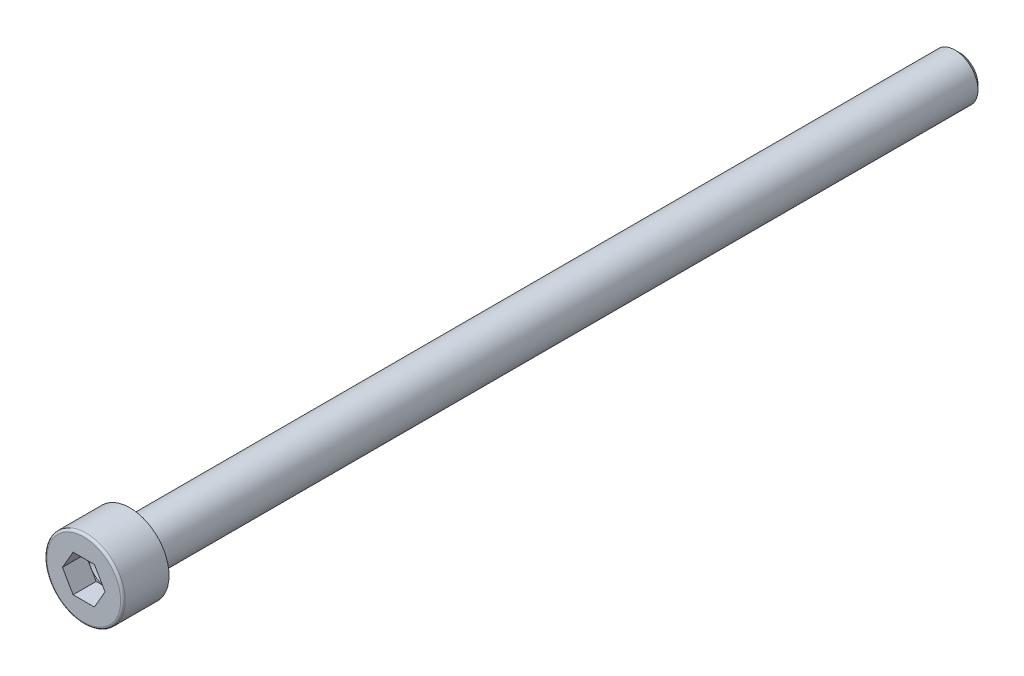
ISO-10303-21;
HEADER;
FILE_DESCRIPTION(('STEP AP214'),'2;1');
FILE_NAME('part.step','',(''),(''),'','','');
FILE_SCHEMA(('AUTOMOTIVE_DESIGN { 1 0 10303 214 1 1 1 1 }'));
ENDSEC;
DATA;
#1=APPLICATION_CONTEXT('core data for automotive mechanical design processes');
#2=APPLICATION_PROTOCOL_DEFINITION('international standard','automotive_design',2000,#1);
#3=PRODUCT_CONTEXT('',#1,'mechanical');
#4=PRODUCT('Part','Part','',(#3));
#5=PRODUCT_RELATED_PRODUCT_CATEGORY('part','',(#4));
#6=PRODUCT_DEFINITION_FORMATION('','',#4);
#7=PRODUCT_DEFINITION_CONTEXT('part definition',#1,'design');
#8=PRODUCT_DEFINITION('design','',#6,#7);
#9=PRODUCT_DEFINITION_SHAPE('','',#8);
#10=(LENGTH_UNIT() NAMED_UNIT(*) SI_UNIT(.MILLI.,.METRE.));
#11=(NAMED_UNIT(*) PLANE_ANGLE_UNIT() SI_UNIT($,.RADIAN.));
#12=(NAMED_UNIT(*) SI_UNIT($,.STERADIAN.) SOLID_ANGLE_UNIT());
#13=UNCERTAINTY_MEASURE_WITH_UNIT(LENGTH_MEASURE(1.E-05),#10,'distance_accuracy_value','');
#14=(GEOMETRIC_REPRESENTATION_CONTEXT(3) GLOBAL_UNCERTAINTY_ASSIGNED_CONTEXT((#13)) GLOBAL_UNIT_ASSIGNED_CONTEXT((#10,
#11,#12)) REPRESENTATION_CONTEXT('',''));
#15=CARTESIAN_POINT('',(0.,0.,0.));
#16=DIRECTION('',(0.,0.,1.));
#17=DIRECTION('',(1.,0.,0.));
#18=AXIS2_PLACEMENT_3D('',#15,#16,#17);
#19=CARTESIAN_POINT('',(0.,0.,92.5));
#20=DIRECTION('',(0.,0.,1.));
#21=DIRECTION('',(1.,0.,0.));
#22=AXIS2_PLACEMENT_3D('',#19,#20,#21);
#23=PLANE('',#22);
#24=DIRECTION('',(-0.500000000000243,-0.866025403784298,0.));
#25=VECTOR('',#24,1.);
#26=CARTESIAN_POINT('',(-1.15470053838,2.,92.5));
#27=LINE('',#26,#25);
#28=CARTESIAN_POINT('',(-1.15470053838,2.,92.5));
#29=VERTEX_POINT('',#28);
#30=CARTESIAN_POINT('',(-1.73205080756968,1.00000000000048,92.5000000013352));
#31=VERTEX_POINT('',#30);
#32=EDGE_CURVE('E145',#29,#31,#27,.T.);
#33=ORIENTED_EDGE('',*,*,#32,.T.);
#34=CARTESIAN_POINT('',(0.,0.,92.5000000011473));
#35=DIRECTION('',(0.,0.,1.));
#36=DIRECTION('',(1.,0.,0.));
#37=AXIS2_PLACEMENT_3D('',#34,#35,#36);
#38=CIRCLE('',#37,1.99999999935001);
#39=CARTESIAN_POINT('',(0.,1.99999999967501,92.5000000005736));
#40=VERTEX_POINT('',#39);
#41=EDGE_CURVE('E372',#31,#40,#38,.F.);
#42=ORIENTED_EDGE('',*,*,#41,.T.);
#43=DIRECTION('',(1.,0.,0.));
#44=VECTOR('',#43,1.);
#45=CARTESIAN_POINT('',(0.,2.,92.5));
#46=LINE('',#45,#44);
#47=EDGE_CURVE('E155',#40,#29,#46,.F.);
#48=ORIENTED_EDGE('',*,*,#47,.T.);
#49=EDGE_LOOP('',(#33,#42,#48));
#50=FACE_BOUND('',#49,.T.);
#51=ADVANCED_FACE('F17',(#50),#23,.T.);
#52=CARTESIAN_POINT('',(0.,0.,92.5));
#53=DIRECTION('',(0.,0.,1.));
#54=DIRECTION('',(1.,0.,0.));
#55=AXIS2_PLACEMENT_3D('',#52,#53,#54);
#56=PLANE('',#55);
#57=DIRECTION('',(1.,0.,0.));
#58=VECTOR('',#57,1.);
#59=CARTESIAN_POINT('',(0.,2.,92.5));
#60=LINE('',#59,#58);
#61=CARTESIAN_POINT('',(1.15470053838,2.,92.5));
#62=VERTEX_POINT('',#61);
#63=EDGE_CURVE('E133',#62,#40,#60,.F.);
#64=ORIENTED_EDGE('',*,*,#63,.T.);
#65=CARTESIAN_POINT('',(0.,0.,92.5000000011473));
#66=DIRECTION('',(0.,0.,1.));
#67=DIRECTION('',(1.,0.,0.));
#68=AXIS2_PLACEMENT_3D('',#65,#66,#67);
#69=CIRCLE('',#68,1.99999999935001);
#70=CARTESIAN_POINT('',(1.73205080728788,0.999999999837748,92.5000000005736));
#71=VERTEX_POINT('',#70);
#72=EDGE_CURVE('E371',#40,#71,#69,.F.);
#73=ORIENTED_EDGE('',*,*,#72,.T.);
#74=DIRECTION('',(-0.500000000000243,0.866025403784298,0.));
#75=VECTOR('',#74,1.);
#76=CARTESIAN_POINT('',(1.73205080757,1.,92.5));
#77=LINE('',#76,#75);
#78=EDGE_CURVE('E139',#71,#62,#77,.T.);
#79=ORIENTED_EDGE('',*,*,#78,.T.);
#80=EDGE_LOOP('',(#64,#73,#79));
#81=FACE_BOUND('',#80,.T.);
#82=ADVANCED_FACE('F218',(#81),#56,.T.);
#83=CARTESIAN_POINT('',(0.,0.,92.5));
#84=DIRECTION('',(0.,0.,1.));
#85=DIRECTION('',(1.,0.,0.));
#86=AXIS2_PLACEMENT_3D('',#83,#84,#85);
#87=PLANE('',#86);
#88=DIRECTION('',(-0.500000000000243,0.866025403784298,0.));
#89=VECTOR('',#88,1.);
#90=CARTESIAN_POINT('',(2.30940107676,0.,92.5));
#91=LINE('',#90,#89);
#92=CARTESIAN_POINT('',(2.30940107675996,0.,92.5));
#93=VERTEX_POINT('',#92);
#94=EDGE_CURVE('E132',#93,#71,#91,.T.);
#95=ORIENTED_EDGE('',*,*,#94,.T.);
#96=CARTESIAN_POINT('',(0.,0.,92.5));
#97=DIRECTION('',(0.,0.,1.));
#98=DIRECTION('',(1.,0.,0.));
#99=AXIS2_PLACEMENT_3D('',#96,#97,#98);
#100=CIRCLE('',#99,1.99999999736283);
#101=CARTESIAN_POINT('',(1.75549951517932,-0.95905202143887,92.5000820987267));
#102=VERTEX_POINT('',#101);
#103=EDGE_CURVE('E191',#71,#102,#100,.F.);
#104=ORIENTED_EDGE('',*,*,#103,.T.);
#105=DIRECTION('',(0.50000000000019,0.866025403784329,0.));
#106=VECTOR('',#105,1.);
#107=CARTESIAN_POINT('',(1.15470053838,-2.,92.5));
#108=LINE('',#107,#106);
#109=EDGE_CURVE('E130',#102,#93,#108,.T.);
#110=ORIENTED_EDGE('',*,*,#109,.T.);
#111=EDGE_LOOP('',(#95,#104,#110));
#112=FACE_BOUND('',#111,.T.);
#113=ADVANCED_FACE('F215',(#112),#87,.T.);
#114=CARTESIAN_POINT('',(0.,0.,92.5));
#115=DIRECTION('',(0.,0.,1.));
#116=DIRECTION('',(1.,0.,0.));
#117=AXIS2_PLACEMENT_3D('',#114,#115,#116);
#118=PLANE('',#117);
#119=DIRECTION('',(1.,0.,0.));
#120=VECTOR('',#119,1.);
#121=CARTESIAN_POINT('',(0.,-2.,92.5));
#122=LINE('',#121,#120);
#123=CARTESIAN_POINT('',(-1.15470053838004,-2.00000000000002,92.5));
#124=VERTEX_POINT('',#123);
#125=CARTESIAN_POINT('',(-9.3085380091339E-07,-2.,92.5000000005736));
#126=VERTEX_POINT('',#125);
#127=EDGE_CURVE('E116',#124,#126,#122,.T.);
#128=ORIENTED_EDGE('',*,*,#127,.T.);
#129=CARTESIAN_POINT('',(0.,0.,92.5000000011473));
#130=DIRECTION('',(0.,0.,1.));
#131=DIRECTION('',(1.,0.,0.));
#132=AXIS2_PLACEMENT_3D('',#129,#130,#131);
#133=CIRCLE('',#132,1.99999999935001);
#134=CARTESIAN_POINT('',(-1.73205192905795,-0.999998056863641,92.5000000005736));
#135=VERTEX_POINT('',#134);
#136=EDGE_CURVE('E185',#126,#135,#133,.F.);
#137=ORIENTED_EDGE('',*,*,#136,.T.);
#138=DIRECTION('',(0.499999999995589,-0.866025403786985,0.));
#139=VECTOR('',#138,1.);
#140=CARTESIAN_POINT('',(-1.73205305112,-0.999996114045,92.5));
#141=LINE('',#140,#139);
#142=EDGE_CURVE('E99',#135,#124,#141,.T.);
#143=ORIENTED_EDGE('',*,*,#142,.T.);
#144=EDGE_LOOP('',(#128,#137,#143));
#145=FACE_BOUND('',#144,.T.);
#146=ADVANCED_FACE('F212',(#145),#118,.T.);
#147=CARTESIAN_POINT('',(0.,0.,92.5));
#148=DIRECTION('',(0.,0.,1.));
#149=DIRECTION('',(1.,0.,0.));
#150=AXIS2_PLACEMENT_3D('',#147,#148,#149);
#151=PLANE('',#150);
#152=DIRECTION('',(0.500000000004897,-0.866025403781611,0.));
#153=VECTOR('',#152,1.);
#154=CARTESIAN_POINT('',(-2.30940107676,0.,92.5));
#155=LINE('',#154,#153);
#156=CARTESIAN_POINT('',(-2.30940107675996,0.,92.5));
#157=VERTEX_POINT('',#156);
#158=EDGE_CURVE('E92',#157,#135,#155,.T.);
#159=ORIENTED_EDGE('',*,*,#158,.T.);
#160=CARTESIAN_POINT('',(0.,0.,92.5));
#161=DIRECTION('',(0.,0.,1.));
#162=DIRECTION('',(1.,0.,0.));
#163=AXIS2_PLACEMENT_3D('',#160,#161,#162);
#164=CIRCLE('',#163,1.99999999736283);
#165=CARTESIAN_POINT('',(-1.75549951517921,0.959052021438731,92.5000820987241));
#166=VERTEX_POINT('',#165);
#167=EDGE_CURVE('E114',#135,#166,#164,.F.);
#168=ORIENTED_EDGE('',*,*,#167,.T.);
#169=DIRECTION('',(-0.50000000000019,-0.866025403784329,0.));
#170=VECTOR('',#169,1.);
#171=CARTESIAN_POINT('',(-1.15470053838,2.,92.5));
#172=LINE('',#171,#170);
#173=EDGE_CURVE('E106',#166,#157,#172,.T.);
#174=ORIENTED_EDGE('',*,*,#173,.T.);
#175=EDGE_LOOP('',(#159,#168,#174));
#176=FACE_BOUND('',#175,.T.);
#177=ADVANCED_FACE('F113',(#176),#151,.T.);
#178=CARTESIAN_POINT('',(0.,0.,92.5070898501303));
#179=DIRECTION('',(0.,0.,1.));
#180=DIRECTION('',(1.,0.,0.));
#181=AXIS2_PLACEMENT_3D('',#178,#179,#180);
#182=CONICAL_SURFACE('',#181,2.01227997796447,1.0471975497099);
#183=CARTESIAN_POINT('',(-3.41060513164848E-10,1.70530256582424E-10,91.3452994597606));
#184=VERTEX_POINT('',#183);
#185=VERTEX_LOOP('',#184);
#186=FACE_BOUND('',#185,.T.);
#187=ORIENTED_EDGE('',*,*,#136,.F.);
#188=CARTESIAN_POINT('',(0.,0.,92.5000000011473));
#189=DIRECTION('',(0.,0.,1.));
#190=DIRECTION('',(1.,0.,0.));
#191=AXIS2_PLACEMENT_3D('',#188,#189,#190);
#192=CIRCLE('',#191,1.99999999935001);
#193=CARTESIAN_POINT('',(1.73205091442586,-0.999999814920083,92.5000000013352));
#194=VERTEX_POINT('',#193);
#195=EDGE_CURVE('E179',#194,#126,#192,.F.);
#196=ORIENTED_EDGE('',*,*,#195,.F.);
#197=CARTESIAN_POINT('',(1.75564235056627,-0.959138248901397,92.5003212874126));
#198=CARTESIAN_POINT('',(1.75171064464167,-0.965948163323212,92.5002142011559));
#199=CARTESIAN_POINT('',(1.74777884757554,-0.972758235606795,92.5001338842035));
#200=CARTESIAN_POINT('',(1.73991507114754,-0.986378695919449,92.5000267889068));
#201=CARTESIAN_POINT('',(1.73598309178567,-0.993189083948522,92.5000000105628));
#202=CARTESIAN_POINT('',(1.73205102128226,-0.999999629839363,92.5000000015231));
#203=B_SPLINE_CURVE_WITH_KNOTS('',3,(#197,#198,#199,#200,#201,#202),.UNSPECIFIED.,.F.,.F.,(4,2,
4),(0.,0.0235920128731562,0.0471840258223739),.UNSPECIFIED.);
#204=EDGE_CURVE('E189',#102,#194,#203,.T.);
#205=ORIENTED_EDGE('',*,*,#204,.F.);
#206=ORIENTED_EDGE('',*,*,#103,.F.);
#207=ORIENTED_EDGE('',*,*,#72,.F.);
#208=ORIENTED_EDGE('',*,*,#41,.F.);
#209=CARTESIAN_POINT('',(-1.75564235056628,0.959138248901369,92.5003212874126));
#210=CARTESIAN_POINT('',(-1.75171060902462,0.965948225013761,92.5002142001858));
#211=CARTESIAN_POINT('',(-1.74777877634059,0.97275835898935,92.5001338827482));
#212=CARTESIAN_POINT('',(-1.73991492867514,0.986378942688881,92.5000267874515));
#213=CARTESIAN_POINT('',(-1.73598291369372,0.993189392412823,92.5000000095926));
#214=CARTESIAN_POINT('',(-1.73205080756994,0.999999999999964,92.5000000015231));
#215=B_SPLINE_CURVE_WITH_KNOTS('',3,(#209,#210,#211,#212,#213,#214),.UNSPECIFIED.,.F.,.F.,(4,2,
4),(0.,0.0235922265842556,0.0471844532445745),.UNSPECIFIED.);
#216=EDGE_CURVE('E105',#166,#31,#215,.T.);
#217=ORIENTED_EDGE('',*,*,#216,.F.);
#218=ORIENTED_EDGE('',*,*,#167,.F.);
#219=EDGE_LOOP('',(#187,#196,#205,#206,#207,#208,#217,#218));
#220=FACE_BOUND('',#219,.T.);
#221=ADVANCED_FACE('F203',(#186,#220),#182,.F.);
#222=CARTESIAN_POINT('',(0.,0.,92.5));
#223=DIRECTION('',(0.,0.,1.));
#224=DIRECTION('',(1.,0.,0.));
#225=AXIS2_PLACEMENT_3D('',#222,#223,#224);
#226=PLANE('',#225);
#227=DIRECTION('',(-0.50000000000019,-0.866025403784329,0.));
#228=VECTOR('',#227,1.);
#229=CARTESIAN_POINT('',(1.15470053838,-2.,92.5));
#230=LINE('',#229,#228);
#231=CARTESIAN_POINT('',(1.15470053838,-2.,92.5));
#232=VERTEX_POINT('',#231);
#233=EDGE_CURVE('E182',#194,#232,#230,.T.);
#234=ORIENTED_EDGE('',*,*,#233,.F.);
#235=ORIENTED_EDGE('',*,*,#195,.T.);
#236=DIRECTION('',(1.,0.,0.));
#237=VECTOR('',#236,1.);
#238=CARTESIAN_POINT('',(0.,-2.,92.5));
#239=LINE('',#238,#237);
#240=EDGE_CURVE('E183',#126,#232,#239,.T.);
#241=ORIENTED_EDGE('',*,*,#240,.T.);
#242=EDGE_LOOP('',(#234,#235,#241));
#243=FACE_BOUND('',#242,.T.);
#244=ADVANCED_FACE('F207',(#243),#226,.T.);
#245=CARTESIAN_POINT('',(1.15470053838,-2.,95.));
#246=DIRECTION('',(-0.866025403784329,0.50000000000019,0.));
#247=DIRECTION('',(-0.50000000000019,-0.866025403784329,0.));
#248=AXIS2_PLACEMENT_3D('',#245,#246,#247);
#249=PLANE('',#248);
#250=DIRECTION('',(-0.50000000000019,-0.866025403784329,0.));
#251=VECTOR('',#250,1.);
#252=CARTESIAN_POINT('',(1.15470053838,-2.,95.));
#253=LINE('',#252,#251);
#254=CARTESIAN_POINT('',(1.15470053838,-2.,95.));
#255=VERTEX_POINT('',#254);
#256=CARTESIAN_POINT('',(2.30940107675996,0.,95.));
#257=VERTEX_POINT('',#256);
#258=EDGE_CURVE('E310',#255,#257,#253,.F.);
#259=ORIENTED_EDGE('',*,*,#258,.T.);
#260=DIRECTION('',(0.,0.,1.));
#261=VECTOR('',#260,1.);
#262=CARTESIAN_POINT('',(2.30940107676,0.,95.));
#263=LINE('',#262,#261);
#264=EDGE_CURVE('E309',#93,#257,#263,.T.);
#265=ORIENTED_EDGE('',*,*,#264,.F.);
#266=ORIENTED_EDGE('',*,*,#109,.F.);
#267=ORIENTED_EDGE('',*,*,#204,.T.);
#268=ORIENTED_EDGE('',*,*,#233,.T.);
#269=DIRECTION('',(0.,0.,1.));
#270=VECTOR('',#269,1.);
#271=CARTESIAN_POINT('',(1.15470053838,-2.,95.));
#272=LINE('',#271,#270);
#273=EDGE_CURVE('E111',#255,#232,#272,.F.);
#274=ORIENTED_EDGE('',*,*,#273,.F.);
#275=EDGE_LOOP('',(#259,#265,#266,#267,#268,#274));
#276=FACE_BOUND('',#275,.T.);
#277=ADVANCED_FACE('F200',(#276),#249,.T.);
#278=CARTESIAN_POINT('',(-1.15470053838,2.,95.));
#279=DIRECTION('',(0.866025403784329,-0.50000000000019,0.));
#280=DIRECTION('',(0.50000000000019,0.866025403784329,0.));
#281=AXIS2_PLACEMENT_3D('',#278,#279,#280);
#282=PLANE('',#281);
#283=DIRECTION('',(0.50000000000019,0.866025403784329,0.));
#284=VECTOR('',#283,1.);
#285=CARTESIAN_POINT('',(-1.15470053838,2.,95.));
#286=LINE('',#285,#284);
#287=CARTESIAN_POINT('',(-1.15470053838,2.,95.));
#288=VERTEX_POINT('',#287);
#289=CARTESIAN_POINT('',(-2.30940107675996,0.,95.));
#290=VERTEX_POINT('',#289);
#291=EDGE_CURVE('E35',#288,#290,#286,.F.);
#292=ORIENTED_EDGE('',*,*,#291,.T.);
#293=DIRECTION('',(0.,0.,1.));
#294=VECTOR('',#293,1.);
#295=CARTESIAN_POINT('',(-2.30940107676,0.,95.));
#296=LINE('',#295,#294);
#297=EDGE_CURVE('E97',#157,#290,#296,.T.);
#298=ORIENTED_EDGE('',*,*,#297,.F.);
#299=ORIENTED_EDGE('',*,*,#173,.F.);
#300=ORIENTED_EDGE('',*,*,#216,.T.);
#301=ORIENTED_EDGE('',*,*,#32,.F.);
#302=DIRECTION('',(0.,0.,-1.));
#303=VECTOR('',#302,1.);
#304=CARTESIAN_POINT('',(-1.15470053838,2.,95.));
#305=LINE('',#304,#303);
#306=EDGE_CURVE('E168',#288,#29,#305,.T.);
#307=ORIENTED_EDGE('',*,*,#306,.F.);
#308=EDGE_LOOP('',(#292,#298,#299,#300,#301,#307));
#309=FACE_BOUND('',#308,.T.);
#310=ADVANCED_FACE('F109',(#309),#282,.T.);
#311=CARTESIAN_POINT('',(2.30940107676,0.,95.));
#312=DIRECTION('',(-0.866025403784329,-0.50000000000019,0.));
#313=DIRECTION('',(0.50000000000019,-0.866025403784329,0.));
#314=AXIS2_PLACEMENT_3D('',#311,#312,#313);
#315=PLANE('',#314);
#316=ORIENTED_EDGE('',*,*,#94,.F.);
#317=ORIENTED_EDGE('',*,*,#264,.T.);
#318=DIRECTION('',(0.500000000000243,-0.866025403784298,0.));
#319=VECTOR('',#318,1.);
#320=CARTESIAN_POINT('',(1.15470053838,2.,95.));
#321=LINE('',#320,#319);
#322=CARTESIAN_POINT('',(1.15470053838006,2.00000000000004,95.));
#323=VERTEX_POINT('',#322);
#324=EDGE_CURVE('E315',#323,#257,#321,.T.);
#325=ORIENTED_EDGE('',*,*,#324,.F.);
#326=DIRECTION('',(0.,0.,-1.));
#327=VECTOR('',#326,1.);
#328=CARTESIAN_POINT('',(1.15470053838,2.,95.));
#329=LINE('',#328,#327);
#330=EDGE_CURVE('E163',#62,#323,#329,.F.);
#331=ORIENTED_EDGE('',*,*,#330,.F.);
#332=ORIENTED_EDGE('',*,*,#78,.F.);
#333=EDGE_LOOP('',(#316,#317,#325,#331,#332));
#334=FACE_BOUND('',#333,.T.);
#335=ADVANCED_FACE('F367',(#334),#315,.T.);
#336=CARTESIAN_POINT('',(-1.15470053838,-2.,95.));
#337=DIRECTION('',(0.,1.,0.));
#338=DIRECTION('',(0.,0.,1.));
#339=AXIS2_PLACEMENT_3D('',#336,#337,#338);
#340=PLANE('',#339);
#341=ORIENTED_EDGE('',*,*,#273,.T.);
#342=ORIENTED_EDGE('',*,*,#240,.F.);
#343=ORIENTED_EDGE('',*,*,#127,.F.);
#344=DIRECTION('',(0.,0.,1.));
#345=VECTOR('',#344,1.);
#346=CARTESIAN_POINT('',(-1.15470053838012,-2.00000000000007,95.));
#347=LINE('',#346,#345);
#348=CARTESIAN_POINT('',(-1.15470053838003,-2.00000000000002,95.));
#349=VERTEX_POINT('',#348);
#350=EDGE_CURVE('E110',#349,#124,#347,.F.);
#351=ORIENTED_EDGE('',*,*,#350,.F.);
#352=DIRECTION('',(1.,0.,0.));
#353=VECTOR('',#352,1.);
#354=CARTESIAN_POINT('',(0.,-2.,95.));
#355=LINE('',#354,#353);
#356=EDGE_CURVE('E324',#255,#349,#355,.F.);
#357=ORIENTED_EDGE('',*,*,#356,.F.);
#358=EDGE_LOOP('',(#341,#342,#343,#351,#357));
#359=FACE_BOUND('',#358,.T.);
#360=ADVANCED_FACE('F361',(#359),#340,.T.);
#361=CARTESIAN_POINT('',(-2.30940107676,0.,95.));
#362=DIRECTION('',(0.866025403784329,0.50000000000019,0.));
#363=DIRECTION('',(-0.50000000000019,0.866025403784329,0.));
#364=AXIS2_PLACEMENT_3D('',#361,#362,#363);
#365=PLANE('',#364);
#366=ORIENTED_EDGE('',*,*,#350,.T.);
#367=ORIENTED_EDGE('',*,*,#142,.F.);
#368=ORIENTED_EDGE('',*,*,#158,.F.);
#369=ORIENTED_EDGE('',*,*,#297,.T.);
#370=DIRECTION('',(-0.500000000000243,0.866025403784298,0.));
#371=VECTOR('',#370,1.);
#372=CARTESIAN_POINT('',(-1.15470053838,-2.,95.));
#373=LINE('',#372,#371);
#374=EDGE_CURVE('E320',#349,#290,#373,.T.);
#375=ORIENTED_EDGE('',*,*,#374,.F.);
#376=EDGE_LOOP('',(#366,#367,#368,#369,#375));
#377=FACE_BOUND('',#376,.T.);
#378=ADVANCED_FACE('F95',(#377),#365,.T.);
#379=CARTESIAN_POINT('',(1.15470053838,2.,95.));
#380=DIRECTION('',(0.,-1.,0.));
#381=DIRECTION('',(0.,0.,-1.));
#382=AXIS2_PLACEMENT_3D('',#379,#380,#381);
#383=PLANE('',#382);
#384=ORIENTED_EDGE('',*,*,#306,.T.);
#385=ORIENTED_EDGE('',*,*,#47,.F.);
#386=ORIENTED_EDGE('',*,*,#63,.F.);
#387=ORIENTED_EDGE('',*,*,#330,.T.);
#388=DIRECTION('',(1.,0.,0.));
#389=VECTOR('',#388,1.);
#390=CARTESIAN_POINT('',(0.,2.,95.));
#391=LINE('',#390,#389);
#392=EDGE_CURVE('E318',#288,#323,#391,.T.);
#393=ORIENTED_EDGE('',*,*,#392,.F.);
#394=EDGE_LOOP('',(#384,#385,#386,#387,#393));
#395=FACE_BOUND('',#394,.T.);
#396=ADVANCED_FACE('F378',(#395),#383,.T.);
#397=CARTESIAN_POINT('',(0.,0.,95.));
#398=DIRECTION('',(0.,0.,1.));
#399=DIRECTION('',(1.,0.,0.));
#400=AXIS2_PLACEMENT_3D('',#397,#398,#399);
#401=PLANE('',#400);
#402=ORIENTED_EDGE('',*,*,#291,.F.);
#403=ORIENTED_EDGE('',*,*,#392,.T.);
#404=ORIENTED_EDGE('',*,*,#324,.T.);
#405=ORIENTED_EDGE('',*,*,#258,.F.);
#406=ORIENTED_EDGE('',*,*,#356,.T.);
#407=ORIENTED_EDGE('',*,*,#374,.T.);
#408=EDGE_LOOP('',(#402,#403,#404,#405,#406,#407));
#409=FACE_BOUND('',#408,.T.);
#410=CARTESIAN_POINT('',(0.,0.,95.));
#411=DIRECTION('',(0.,0.,-1.));
#412=DIRECTION('',(1.,0.,0.));
#413=AXIS2_PLACEMENT_3D('',#410,#411,#412);
#414=CIRCLE('',#413,4.);
#415=CARTESIAN_POINT('',(4.,0.,95.));
#416=VERTEX_POINT('',#415);
#417=EDGE_CURVE('E290',#416,#416,#414,.T.);
#418=ORIENTED_EDGE('',*,*,#417,.F.);
#419=EDGE_LOOP('',(#418));
#420=FACE_BOUND('',#419,.T.);
#421=ADVANCED_FACE('F276',(#409,#420),#401,.T.);
#422=CARTESIAN_POINT('',(0.,0.,94.75));
#423=DIRECTION('',(0.,0.,1.));
#424=DIRECTION('',(1.,0.,0.));
#425=AXIS2_PLACEMENT_3D('',#422,#423,#424);
#426=TOROIDAL_SURFACE('',#425,4.,0.25);
#427=CARTESIAN_POINT('',(0.,0.,94.75));
#428=DIRECTION('',(0.,0.,1.));
#429=DIRECTION('',(1.,0.,0.));
#430=AXIS2_PLACEMENT_3D('',#427,#428,#429);
#431=CIRCLE('',#430,4.25);
#432=CARTESIAN_POINT('',(4.25,0.,94.75));
#433=VERTEX_POINT('',#432);
#434=EDGE_CURVE('E178',#433,#433,#431,.F.);
#435=ORIENTED_EDGE('',*,*,#434,.F.);
#436=EDGE_LOOP('',(#435));
#437=FACE_BOUND('',#436,.T.);
#438=ORIENTED_EDGE('',*,*,#417,.T.);
#439=EDGE_LOOP('',(#438));
#440=FACE_BOUND('',#439,.T.);
#441=ADVANCED_FACE('F270',(#437,#440),#426,.T.);
#442=CARTESIAN_POINT('',(0.,0.,47.5));
#443=DIRECTION('',(0.,0.,1.));
#444=DIRECTION('',(1.,0.,0.));
#445=AXIS2_PLACEMENT_3D('',#442,#443,#444);
#446=CYLINDRICAL_SURFACE('',#445,4.25);
#447=CARTESIAN_POINT('',(0.,0.,90.));
#448=DIRECTION('',(0.,0.,1.));
#449=DIRECTION('',(1.,0.,0.));
#450=AXIS2_PLACEMENT_3D('',#447,#448,#449);
#451=CIRCLE('',#450,4.25);
#452=CARTESIAN_POINT('',(4.25,0.,90.));
#453=VERTEX_POINT('',#452);
#454=EDGE_CURVE('E175',#453,#453,#451,.F.);
#455=ORIENTED_EDGE('',*,*,#454,.F.);
#456=EDGE_LOOP('',(#455));
#457=FACE_BOUND('',#456,.T.);
#458=ORIENTED_EDGE('',*,*,#434,.T.);
#459=EDGE_LOOP('',(#458));
#460=FACE_BOUND('',#459,.T.);
#461=ADVANCED_FACE('F267',(#457,#460),#446,.T.);
#462=CARTESIAN_POINT('',(0.,0.,90.));
#463=DIRECTION('',(0.,0.,-1.));
#464=DIRECTION('',(-1.,0.,0.));
#465=AXIS2_PLACEMENT_3D('',#462,#463,#464);
#466=PLANE('',#465);
#467=CARTESIAN_POINT('',(0.,0.,90.));
#468=DIRECTION('',(0.,0.,-1.));
#469=DIRECTION('',(1.,0.,0.));
#470=AXIS2_PLACEMENT_3D('',#467,#468,#469);
#471=CIRCLE('',#470,2.75);
#472=CARTESIAN_POINT('',(2.75,0.,90.));
#473=VERTEX_POINT('',#472);
#474=EDGE_CURVE('E174',#473,#473,#471,.F.);
#475=ORIENTED_EDGE('',*,*,#474,.T.);
#476=EDGE_LOOP('',(#475));
#477=FACE_BOUND('',#476,.T.);
#478=ORIENTED_EDGE('',*,*,#454,.T.);
#479=EDGE_LOOP('',(#478));
#480=FACE_BOUND('',#479,.T.);
#481=ADVANCED_FACE('F258',(#477,#480),#466,.T.);
#482=CARTESIAN_POINT('',(0.,0.,0.));
#483=DIRECTION('',(0.,0.,1.));
#484=DIRECTION('',(1.,0.,0.));
#485=AXIS2_PLACEMENT_3D('',#482,#483,#484);
#486=PLANE('',#485);
#487=CARTESIAN_POINT('',(0.,0.,9.09494701772928E-10));
#488=DIRECTION('',(0.,0.,1.));
#489=DIRECTION('',(1.,0.,0.));
#490=AXIS2_PLACEMENT_3D('',#487,#488,#489);
#491=CIRCLE('',#490,1.99999999909715);
#492=CARTESIAN_POINT('',(1.99999999909715,0.,9.09494701772928E-10));
#493=VERTEX_POINT('',#492);
#494=EDGE_CURVE('E171',#493,#493,#491,.T.);
#495=ORIENTED_EDGE('',*,*,#494,.F.);
#496=EDGE_LOOP('',(#495));
#497=FACE_BOUND('',#496,.T.);
#498=ADVANCED_FACE('F242',(#497),#486,.F.);
#499=CARTESIAN_POINT('',(0.,0.,89.75));
#500=DIRECTION('',(0.,0.,-1.));
#501=DIRECTION('',(-1.,0.,0.));
#502=AXIS2_PLACEMENT_3D('',#499,#500,#501);
#503=TOROIDAL_SURFACE('',#502,2.75,0.25);
#504=ORIENTED_EDGE('',*,*,#474,.F.);
#505=EDGE_LOOP('',(#504));
#506=FACE_BOUND('',#505,.T.);
#507=CARTESIAN_POINT('',(0.,0.,89.75));
#508=DIRECTION('',(0.,0.,-1.));
#509=DIRECTION('',(-1.,0.,0.));
#510=AXIS2_PLACEMENT_3D('',#507,#508,#509);
#511=CIRCLE('',#510,2.5);
#512=CARTESIAN_POINT('',(-2.5,0.,89.75));
#513=VERTEX_POINT('',#512);
#514=EDGE_CURVE('E26',#513,#513,#511,.T.);
#515=ORIENTED_EDGE('',*,*,#514,.F.);
#516=EDGE_LOOP('',(#515));
#517=FACE_BOUND('',#516,.T.);
#518=ADVANCED_FACE('F233',(#506,#517),#503,.F.);
#519=CARTESIAN_POINT('',(0.,0.,0.500000001238732));
#520=DIRECTION('',(0.,0.,1.));
#521=DIRECTION('',(1.,0.,0.));
#522=AXIS2_PLACEMENT_3D('',#519,#520,#521);
#523=CONICAL_SURFACE('',#522,2.49999999854836,0.785398162519414);
#524=CARTESIAN_POINT('',(0.,0.,0.5));
#525=DIRECTION('',(0.,0.,-1.));
#526=DIRECTION('',(-1.,0.,0.));
#527=AXIS2_PLACEMENT_3D('',#524,#525,#526);
#528=CIRCLE('',#527,2.5);
#529=CARTESIAN_POINT('',(-2.5,0.,0.5));
#530=VERTEX_POINT('',#529);
#531=EDGE_CURVE('E11',#530,#530,#528,.F.);
#532=ORIENTED_EDGE('',*,*,#531,.F.);
#533=EDGE_LOOP('',(#532));
#534=FACE_BOUND('',#533,.T.);
#535=ORIENTED_EDGE('',*,*,#494,.T.);
#536=EDGE_LOOP('',(#535));
#537=FACE_BOUND('',#536,.T.);
#538=ADVANCED_FACE('F227',(#534,#537),#523,.T.);
#539=CARTESIAN_POINT('',(0.,0.,45.));
#540=DIRECTION('',(0.,0.,-1.));
#541=DIRECTION('',(-1.,0.,0.));
#542=AXIS2_PLACEMENT_3D('',#539,#540,#541);
#543=CYLINDRICAL_SURFACE('',#542,2.5);
#544=ORIENTED_EDGE('',*,*,#531,.T.);
#545=EDGE_LOOP('',(#544));
#546=FACE_BOUND('',#545,.T.);
#547=ORIENTED_EDGE('',*,*,#514,.T.);
#548=EDGE_LOOP('',(#547));
#549=FACE_BOUND('',#548,.T.);
#550=ADVANCED_FACE('F225',(#546,#549),#543,.T.);
#551=CLOSED_SHELL('',(#51,#82,#113,#146,#177,#221,#244,#277,#310,#335,#360,#378,#396,#421,#441,
#461,#481,#498,#518,#538,#550));
#552=MANIFOLD_SOLID_BREP('B1',#551);
#553=ADVANCED_BREP_SHAPE_REPRESENTATION('',(#18,#552),#14);
#554=SHAPE_DEFINITION_REPRESENTATION(#9,#553);
ENDSEC;
END-ISO-10303-21;
